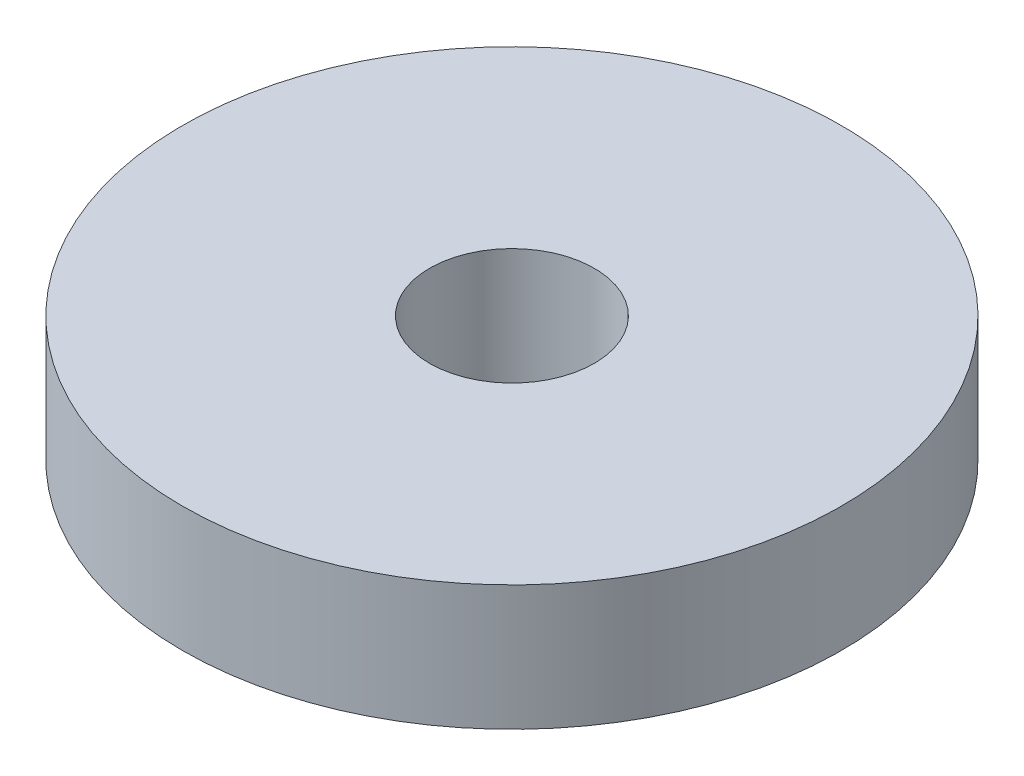
ISO-10303-21;
HEADER;
FILE_DESCRIPTION(('STEP AP214'),'2;1');
FILE_NAME('part.step','',(''),(''),'','','');
FILE_SCHEMA(('AUTOMOTIVE_DESIGN { 1 0 10303 214 1 1 1 1 }'));
ENDSEC;
DATA;
#1=APPLICATION_CONTEXT('core data for automotive mechanical design processes');
#2=APPLICATION_PROTOCOL_DEFINITION('international standard','automotive_design',2000,#1);
#3=PRODUCT_CONTEXT('',#1,'mechanical');
#4=PRODUCT('Part','Part','',(#3));
#5=PRODUCT_RELATED_PRODUCT_CATEGORY('part','',(#4));
#6=PRODUCT_DEFINITION_FORMATION('','',#4);
#7=PRODUCT_DEFINITION_CONTEXT('part definition',#1,'design');
#8=PRODUCT_DEFINITION('design','',#6,#7);
#9=PRODUCT_DEFINITION_SHAPE('','',#8);
#10=(LENGTH_UNIT() NAMED_UNIT(*) SI_UNIT(.MILLI.,.METRE.));
#11=(NAMED_UNIT(*) PLANE_ANGLE_UNIT() SI_UNIT($,.RADIAN.));
#12=(NAMED_UNIT(*) SI_UNIT($,.STERADIAN.) SOLID_ANGLE_UNIT());
#13=UNCERTAINTY_MEASURE_WITH_UNIT(LENGTH_MEASURE(1.E-05),#10,'distance_accuracy_value','');
#14=(GEOMETRIC_REPRESENTATION_CONTEXT(3) GLOBAL_UNCERTAINTY_ASSIGNED_CONTEXT((#13)) GLOBAL_UNIT_ASSIGNED_CONTEXT((#10,
#11,#12)) REPRESENTATION_CONTEXT('',''));
#15=CARTESIAN_POINT('',(0.,0.,0.));
#16=DIRECTION('',(0.,0.,1.));
#17=DIRECTION('',(1.,0.,0.));
#18=AXIS2_PLACEMENT_3D('',#15,#16,#17);
#19=CARTESIAN_POINT('',(0.,2.41,0.));
#20=DIRECTION('',(0.,1.,0.));
#21=DIRECTION('',(0.,0.,1.));
#22=AXIS2_PLACEMENT_3D('',#19,#20,#21);
#23=PLANE('',#22);
#24=CARTESIAN_POINT('',(0.,2.41,0.));
#25=DIRECTION('',(0.,1.,0.));
#26=DIRECTION('',(0.,0.,1.));
#27=AXIS2_PLACEMENT_3D('',#24,#25,#26);
#28=CIRCLE('',#27,6.35);
#29=CARTESIAN_POINT('',(0.,2.41,6.35));
#30=VERTEX_POINT('',#29);
#31=EDGE_CURVE('E10',#30,#30,#28,.T.);
#32=ORIENTED_EDGE('',*,*,#31,.T.);
#33=EDGE_LOOP('',(#32));
#34=FACE_BOUND('',#33,.T.);
#35=CARTESIAN_POINT('',(0.,2.41,0.));
#36=DIRECTION('',(0.,1.,0.));
#37=DIRECTION('',(0.,0.,1.));
#38=AXIS2_PLACEMENT_3D('',#35,#36,#37);
#39=CIRCLE('',#38,1.5875);
#40=CARTESIAN_POINT('',(0.,2.41,1.5875));
#41=VERTEX_POINT('',#40);
#42=EDGE_CURVE('E46',#41,#41,#39,.T.);
#43=ORIENTED_EDGE('',*,*,#42,.F.);
#44=EDGE_LOOP('',(#43));
#45=FACE_BOUND('',#44,.T.);
#46=ADVANCED_FACE('F35',(#34,#45),#23,.T.);
#47=CARTESIAN_POINT('',(0.,0.,0.));
#48=DIRECTION('',(0.,1.,0.));
#49=DIRECTION('',(0.,0.,1.));
#50=AXIS2_PLACEMENT_3D('',#47,#48,#49);
#51=PLANE('',#50);
#52=CARTESIAN_POINT('',(0.,0.,0.));
#53=DIRECTION('',(0.,1.,0.));
#54=DIRECTION('',(0.,0.,1.));
#55=AXIS2_PLACEMENT_3D('',#52,#53,#54);
#56=CIRCLE('',#55,6.35);
#57=CARTESIAN_POINT('',(0.,0.,6.35));
#58=VERTEX_POINT('',#57);
#59=EDGE_CURVE('E39',#58,#58,#56,.T.);
#60=ORIENTED_EDGE('',*,*,#59,.F.);
#61=EDGE_LOOP('',(#60));
#62=FACE_BOUND('',#61,.T.);
#63=CARTESIAN_POINT('',(0.,0.,0.));
#64=DIRECTION('',(0.,1.,0.));
#65=DIRECTION('',(0.,0.,1.));
#66=AXIS2_PLACEMENT_3D('',#63,#64,#65);
#67=CIRCLE('',#66,1.5875);
#68=CARTESIAN_POINT('',(0.,0.,1.5875));
#69=VERTEX_POINT('',#68);
#70=EDGE_CURVE('E48',#69,#69,#67,.T.);
#71=ORIENTED_EDGE('',*,*,#70,.T.);
#72=EDGE_LOOP('',(#71));
#73=FACE_BOUND('',#72,.T.);
#74=ADVANCED_FACE('F58',(#62,#73),#51,.F.);
#75=CARTESIAN_POINT('',(0.,2.41,0.));
#76=DIRECTION('',(0.,-1.,0.));
#77=DIRECTION('',(0.,0.,-1.));
#78=AXIS2_PLACEMENT_3D('',#75,#76,#77);
#79=CYLINDRICAL_SURFACE('',#78,6.35);
#80=ORIENTED_EDGE('',*,*,#31,.F.);
#81=EDGE_LOOP('',(#80));
#82=FACE_BOUND('',#81,.T.);
#83=ORIENTED_EDGE('',*,*,#59,.T.);
#84=EDGE_LOOP('',(#83));
#85=FACE_BOUND('',#84,.T.);
#86=ADVANCED_FACE('F37',(#82,#85),#79,.T.);
#87=CARTESIAN_POINT('',(0.,2.41,0.));
#88=DIRECTION('',(0.,-1.,0.));
#89=DIRECTION('',(0.,0.,-1.));
#90=AXIS2_PLACEMENT_3D('',#87,#88,#89);
#91=CYLINDRICAL_SURFACE('',#90,1.5875);
#92=ORIENTED_EDGE('',*,*,#42,.T.);
#93=EDGE_LOOP('',(#92));
#94=FACE_BOUND('',#93,.T.);
#95=ORIENTED_EDGE('',*,*,#70,.F.);
#96=EDGE_LOOP('',(#95));
#97=FACE_BOUND('',#96,.T.);
#98=ADVANCED_FACE('F54',(#94,#97),#91,.F.);
#99=CLOSED_SHELL('',(#46,#74,#86,#98));
#100=MANIFOLD_SOLID_BREP('B2',#99);
#101=ADVANCED_BREP_SHAPE_REPRESENTATION('',(#18,#100),#14);
#102=SHAPE_DEFINITION_REPRESENTATION(#9,#101);
ENDSEC;
END-ISO-10303-21;
